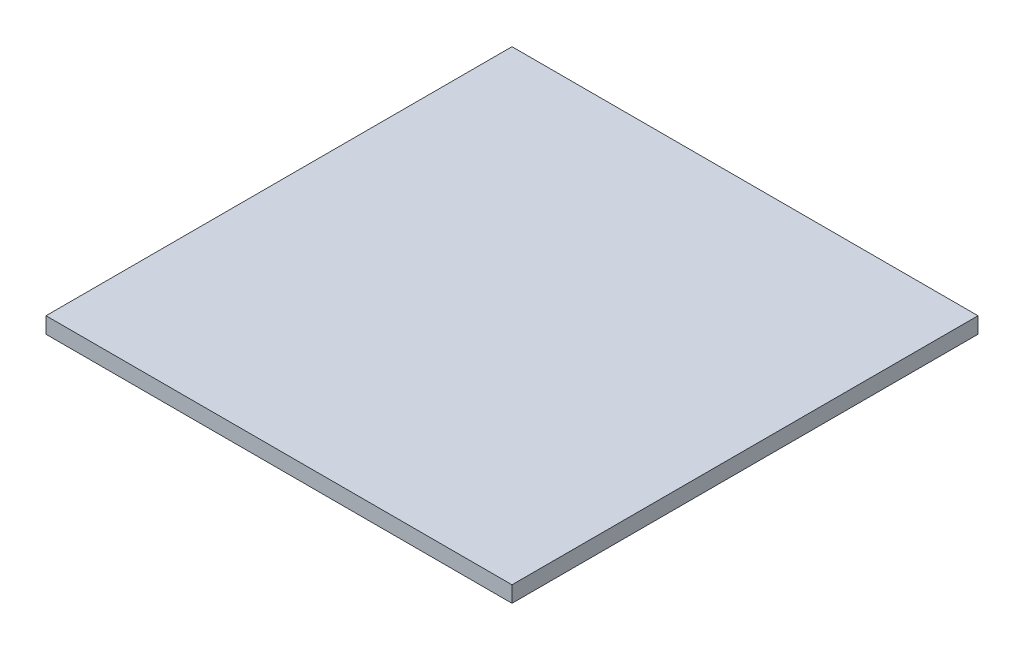
ISO-10303-21;
HEADER;
FILE_DESCRIPTION(('STEP AP214'),'2;1');
FILE_NAME('part.step','',(''),(''),'','','');
FILE_SCHEMA(('AUTOMOTIVE_DESIGN { 1 0 10303 214 1 1 1 1 }'));
ENDSEC;
DATA;
#1=APPLICATION_CONTEXT('core data for automotive mechanical design processes');
#2=APPLICATION_PROTOCOL_DEFINITION('international standard','automotive_design',2000,#1);
#3=PRODUCT_CONTEXT('',#1,'mechanical');
#4=PRODUCT('Part','Part','',(#3));
#5=PRODUCT_RELATED_PRODUCT_CATEGORY('part','',(#4));
#6=PRODUCT_DEFINITION_FORMATION('','',#4);
#7=PRODUCT_DEFINITION_CONTEXT('part definition',#1,'design');
#8=PRODUCT_DEFINITION('design','',#6,#7);
#9=PRODUCT_DEFINITION_SHAPE('','',#8);
#10=(LENGTH_UNIT() NAMED_UNIT(*) SI_UNIT(.MILLI.,.METRE.));
#11=(NAMED_UNIT(*) PLANE_ANGLE_UNIT() SI_UNIT($,.RADIAN.));
#12=(NAMED_UNIT(*) SI_UNIT($,.STERADIAN.) SOLID_ANGLE_UNIT());
#13=UNCERTAINTY_MEASURE_WITH_UNIT(LENGTH_MEASURE(1.E-05),#10,'distance_accuracy_value','');
#14=(GEOMETRIC_REPRESENTATION_CONTEXT(3) GLOBAL_UNCERTAINTY_ASSIGNED_CONTEXT((#13)) GLOBAL_UNIT_ASSIGNED_CONTEXT((#10,
#11,#12)) REPRESENTATION_CONTEXT('',''));
#15=CARTESIAN_POINT('',(0.,0.,0.));
#16=DIRECTION('',(0.,0.,1.));
#17=DIRECTION('',(1.,0.,0.));
#18=AXIS2_PLACEMENT_3D('',#15,#16,#17);
#19=CARTESIAN_POINT('',(184.416544989199,26.,-43.4985845814638));
#20=DIRECTION('',(-1.,0.,0.));
#21=DIRECTION('',(0.,0.,1.));
#22=AXIS2_PLACEMENT_3D('',#19,#20,#21);
#23=PLANE('',#22);
#24=DIRECTION('',(0.,0.,-1.));
#25=VECTOR('',#24,1.);
#26=CARTESIAN_POINT('',(184.416544989199,23.,-43.4985845814638));
#27=LINE('',#26,#25);
#28=CARTESIAN_POINT('',(184.416544989199,23.,43.4985845814638));
#29=VERTEX_POINT('',#28);
#30=CARTESIAN_POINT('',(184.416544989199,23.,-43.4985845814638));
#31=VERTEX_POINT('',#30);
#32=EDGE_CURVE('E96',#29,#31,#27,.T.);
#33=ORIENTED_EDGE('',*,*,#32,.T.);
#34=DIRECTION('',(0.,-1.,0.));
#35=VECTOR('',#34,1.);
#36=CARTESIAN_POINT('',(184.416544989199,26.,-43.4985845814638));
#37=LINE('',#36,#35);
#38=CARTESIAN_POINT('',(184.416544989199,26.,-43.4985845814638));
#39=VERTEX_POINT('',#38);
#40=EDGE_CURVE('E11',#39,#31,#37,.T.);
#41=ORIENTED_EDGE('',*,*,#40,.F.);
#42=DIRECTION('',(0.,0.,-1.));
#43=VECTOR('',#42,1.);
#44=CARTESIAN_POINT('',(184.416544989199,26.,-43.4985845814638));
#45=LINE('',#44,#43);
#46=CARTESIAN_POINT('',(184.416544989199,26.,43.4985845814638));
#47=VERTEX_POINT('',#46);
#48=EDGE_CURVE('E84',#47,#39,#45,.T.);
#49=ORIENTED_EDGE('',*,*,#48,.F.);
#50=DIRECTION('',(0.,-1.,0.));
#51=VECTOR('',#50,1.);
#52=CARTESIAN_POINT('',(184.416544989199,26.,43.4985845814638));
#53=LINE('',#52,#51);
#54=EDGE_CURVE('E92',#47,#29,#53,.T.);
#55=ORIENTED_EDGE('',*,*,#54,.T.);
#56=EDGE_LOOP('',(#33,#41,#49,#55));
#57=FACE_BOUND('',#56,.T.);
#58=ADVANCED_FACE('F33',(#57),#23,.F.);
#59=CARTESIAN_POINT('',(184.416544989199,26.,-43.4985845814638));
#60=DIRECTION('',(0.,0.,1.));
#61=DIRECTION('',(1.,0.,0.));
#62=AXIS2_PLACEMENT_3D('',#59,#60,#61);
#63=PLANE('',#62);
#64=DIRECTION('',(-1.,0.,0.));
#65=VECTOR('',#64,1.);
#66=CARTESIAN_POINT('',(184.416544989199,23.,-43.4985845814638));
#67=LINE('',#66,#65);
#68=CARTESIAN_POINT('',(97.4193758262716,23.,-43.4985845814638));
#69=VERTEX_POINT('',#68);
#70=EDGE_CURVE('E88',#31,#69,#67,.T.);
#71=ORIENTED_EDGE('',*,*,#70,.T.);
#72=DIRECTION('',(0.,-1.,0.));
#73=VECTOR('',#72,1.);
#74=CARTESIAN_POINT('',(97.4193758262716,26.,-43.4985845814638));
#75=LINE('',#74,#73);
#76=CARTESIAN_POINT('',(97.4193758262716,26.,-43.4985845814638));
#77=VERTEX_POINT('',#76);
#78=EDGE_CURVE('E41',#77,#69,#75,.T.);
#79=ORIENTED_EDGE('',*,*,#78,.F.);
#80=DIRECTION('',(-1.,0.,0.));
#81=VECTOR('',#80,1.);
#82=CARTESIAN_POINT('',(184.416544989199,26.,-43.4985845814638));
#83=LINE('',#82,#81);
#84=EDGE_CURVE('E79',#39,#77,#83,.T.);
#85=ORIENTED_EDGE('',*,*,#84,.F.);
#86=ORIENTED_EDGE('',*,*,#40,.T.);
#87=EDGE_LOOP('',(#71,#79,#85,#86));
#88=FACE_BOUND('',#87,.T.);
#89=ADVANCED_FACE('F87',(#88),#63,.F.);
#90=CARTESIAN_POINT('',(97.4193758262716,26.,-43.4985845814638));
#91=DIRECTION('',(1.,0.,0.));
#92=DIRECTION('',(0.,0.,-1.));
#93=AXIS2_PLACEMENT_3D('',#90,#91,#92);
#94=PLANE('',#93);
#95=DIRECTION('',(0.,0.,1.));
#96=VECTOR('',#95,1.);
#97=CARTESIAN_POINT('',(97.4193758262716,23.,-43.4985845814638));
#98=LINE('',#97,#96);
#99=CARTESIAN_POINT('',(97.4193758262716,23.,43.4985845814638));
#100=VERTEX_POINT('',#99);
#101=EDGE_CURVE('E66',#69,#100,#98,.T.);
#102=ORIENTED_EDGE('',*,*,#101,.T.);
#103=DIRECTION('',(0.,-1.,0.));
#104=VECTOR('',#103,1.);
#105=CARTESIAN_POINT('',(97.4193758262716,26.,43.4985845814638));
#106=LINE('',#105,#104);
#107=CARTESIAN_POINT('',(97.4193758262716,26.,43.4985845814638));
#108=VERTEX_POINT('',#107);
#109=EDGE_CURVE('E89',#108,#100,#106,.T.);
#110=ORIENTED_EDGE('',*,*,#109,.F.);
#111=DIRECTION('',(0.,0.,1.));
#112=VECTOR('',#111,1.);
#113=CARTESIAN_POINT('',(97.4193758262716,26.,-43.4985845814638));
#114=LINE('',#113,#112);
#115=EDGE_CURVE('E82',#77,#108,#114,.T.);
#116=ORIENTED_EDGE('',*,*,#115,.F.);
#117=ORIENTED_EDGE('',*,*,#78,.T.);
#118=EDGE_LOOP('',(#102,#110,#116,#117));
#119=FACE_BOUND('',#118,.T.);
#120=ADVANCED_FACE('F90',(#119),#94,.F.);
#121=CARTESIAN_POINT('',(184.416544989199,26.,43.4985845814638));
#122=DIRECTION('',(0.,0.,-1.));
#123=DIRECTION('',(-1.,0.,0.));
#124=AXIS2_PLACEMENT_3D('',#121,#122,#123);
#125=PLANE('',#124);
#126=DIRECTION('',(1.,0.,0.));
#127=VECTOR('',#126,1.);
#128=CARTESIAN_POINT('',(184.416544989199,23.,43.4985845814638));
#129=LINE('',#128,#127);
#130=EDGE_CURVE('E72',#100,#29,#129,.T.);
#131=ORIENTED_EDGE('',*,*,#130,.T.);
#132=ORIENTED_EDGE('',*,*,#54,.F.);
#133=DIRECTION('',(1.,0.,0.));
#134=VECTOR('',#133,1.);
#135=CARTESIAN_POINT('',(184.416544989199,26.,43.4985845814638));
#136=LINE('',#135,#134);
#137=EDGE_CURVE('E49',#108,#47,#136,.T.);
#138=ORIENTED_EDGE('',*,*,#137,.F.);
#139=ORIENTED_EDGE('',*,*,#109,.T.);
#140=EDGE_LOOP('',(#131,#132,#138,#139));
#141=FACE_BOUND('',#140,.T.);
#142=ADVANCED_FACE('F103',(#141),#125,.F.);
#143=CARTESIAN_POINT('',(0.,26.,0.));
#144=DIRECTION('',(0.,-1.,0.));
#145=DIRECTION('',(0.,0.,-1.));
#146=AXIS2_PLACEMENT_3D('',#143,#144,#145);
#147=PLANE('',#146);
#148=ORIENTED_EDGE('',*,*,#48,.T.);
#149=ORIENTED_EDGE('',*,*,#84,.T.);
#150=ORIENTED_EDGE('',*,*,#115,.T.);
#151=ORIENTED_EDGE('',*,*,#137,.T.);
#152=EDGE_LOOP('',(#148,#149,#150,#151));
#153=FACE_BOUND('',#152,.T.);
#154=ADVANCED_FACE('F80',(#153),#147,.F.);
#155=CARTESIAN_POINT('',(0.,23.,0.));
#156=DIRECTION('',(0.,-1.,0.));
#157=DIRECTION('',(0.,0.,-1.));
#158=AXIS2_PLACEMENT_3D('',#155,#156,#157);
#159=PLANE('',#158);
#160=ORIENTED_EDGE('',*,*,#32,.F.);
#161=ORIENTED_EDGE('',*,*,#130,.F.);
#162=ORIENTED_EDGE('',*,*,#101,.F.);
#163=ORIENTED_EDGE('',*,*,#70,.F.);
#164=EDGE_LOOP('',(#160,#161,#162,#163));
#165=FACE_BOUND('',#164,.T.);
#166=ADVANCED_FACE('F106',(#165),#159,.T.);
#167=CLOSED_SHELL('',(#58,#89,#120,#142,#154,#166));
#168=MANIFOLD_SOLID_BREP('B2',#167);
#169=ADVANCED_BREP_SHAPE_REPRESENTATION('',(#18,#168),#14);
#170=SHAPE_DEFINITION_REPRESENTATION(#9,#169);
ENDSEC;
END-ISO-10303-21;
